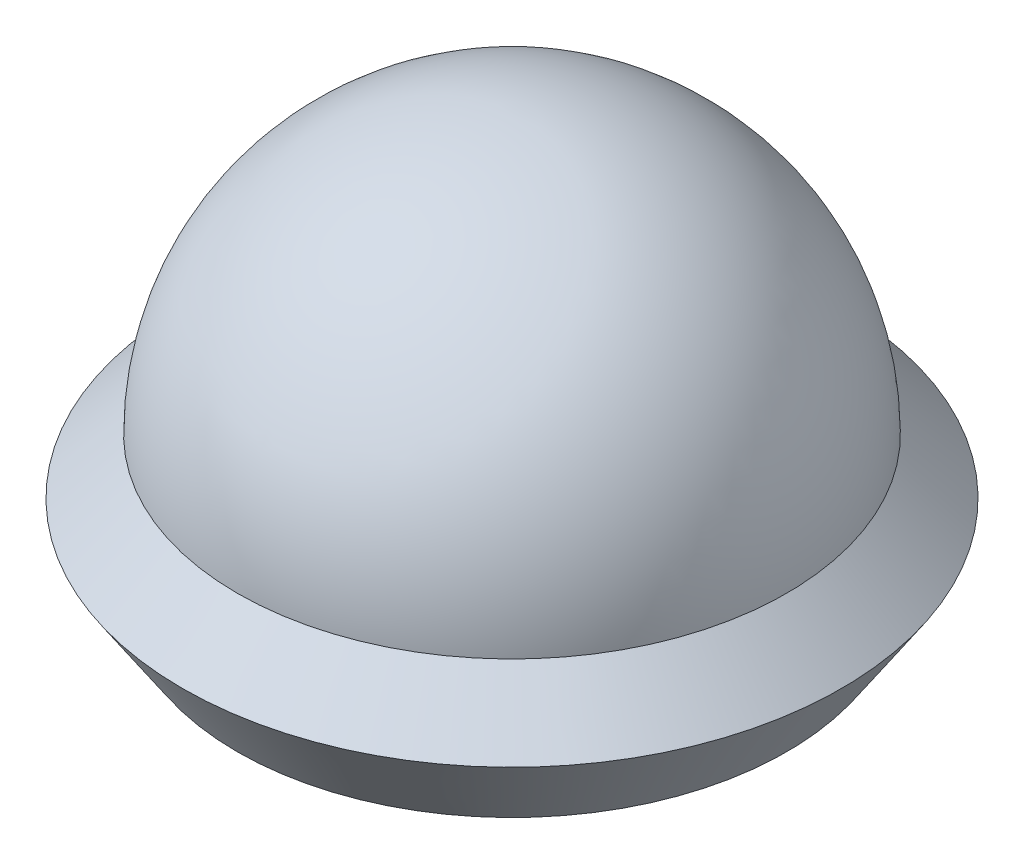
ISO-10303-21;
HEADER;
FILE_DESCRIPTION(('STEP AP214'),'2;1');
FILE_NAME('part.step','',(''),(''),'','','');
FILE_SCHEMA(('AUTOMOTIVE_DESIGN { 1 0 10303 214 1 1 1 1 }'));
ENDSEC;
DATA;
#1=APPLICATION_CONTEXT('core data for automotive mechanical design processes');
#2=APPLICATION_PROTOCOL_DEFINITION('international standard','automotive_design',2000,#1);
#3=PRODUCT_CONTEXT('',#1,'mechanical');
#4=PRODUCT('Part','Part','',(#3));
#5=PRODUCT_RELATED_PRODUCT_CATEGORY('part','',(#4));
#6=PRODUCT_DEFINITION_FORMATION('','',#4);
#7=PRODUCT_DEFINITION_CONTEXT('part definition',#1,'design');
#8=PRODUCT_DEFINITION('design','',#6,#7);
#9=PRODUCT_DEFINITION_SHAPE('','',#8);
#10=(LENGTH_UNIT() NAMED_UNIT(*) SI_UNIT(.MILLI.,.METRE.));
#11=(NAMED_UNIT(*) PLANE_ANGLE_UNIT() SI_UNIT($,.RADIAN.));
#12=(NAMED_UNIT(*) SI_UNIT($,.STERADIAN.) SOLID_ANGLE_UNIT());
#13=UNCERTAINTY_MEASURE_WITH_UNIT(LENGTH_MEASURE(1.E-05),#10,'distance_accuracy_value','');
#14=(GEOMETRIC_REPRESENTATION_CONTEXT(3) GLOBAL_UNCERTAINTY_ASSIGNED_CONTEXT((#13)) GLOBAL_UNIT_ASSIGNED_CONTEXT((#10,
#11,#12)) REPRESENTATION_CONTEXT('',''));
#15=CARTESIAN_POINT('',(0.,0.,0.));
#16=DIRECTION('',(0.,0.,1.));
#17=DIRECTION('',(1.,0.,0.));
#18=AXIS2_PLACEMENT_3D('',#15,#16,#17);
#19=CARTESIAN_POINT('',(0.,6.,0.));
#20=DIRECTION('',(0.,-1.,0.));
#21=DIRECTION('',(0.,0.,-1.));
#22=AXIS2_PLACEMENT_3D('',#19,#20,#21);
#23=CONICAL_SURFACE('',#22,24.,0.785398163397448);
#24=CARTESIAN_POINT('',(0.,10.,0.));
#25=DIRECTION('',(0.,-1.,0.));
#26=DIRECTION('',(0.,0.,1.));
#27=AXIS2_PLACEMENT_3D('',#24,#25,#26);
#28=CIRCLE('',#27,20.);
#29=CARTESIAN_POINT('',(0.,9.99999999999986,20.));
#30=VERTEX_POINT('',#29);
#31=EDGE_CURVE('E112',#30,#30,#28,.T.);
#32=ORIENTED_EDGE('',*,*,#31,.T.);
#33=EDGE_LOOP('',(#32));
#34=FACE_BOUND('',#33,.T.);
#35=CARTESIAN_POINT('',(0.,6.,0.));
#36=DIRECTION('',(0.,-1.,0.));
#37=DIRECTION('',(0.,0.,-1.));
#38=AXIS2_PLACEMENT_3D('',#35,#36,#37);
#39=CIRCLE('',#38,24.);
#40=CARTESIAN_POINT('',(0.,6.,-24.));
#41=VERTEX_POINT('',#40);
#42=EDGE_CURVE('E11',#41,#41,#39,.T.);
#43=ORIENTED_EDGE('',*,*,#42,.F.);
#44=EDGE_LOOP('',(#43));
#45=FACE_BOUND('',#44,.T.);
#46=ADVANCED_FACE('F37',(#34,#45),#23,.T.);
#47=CARTESIAN_POINT('',(0.,0.,0.));
#48=DIRECTION('',(0.,1.,0.));
#49=DIRECTION('',(0.,0.,1.));
#50=AXIS2_PLACEMENT_3D('',#47,#48,#49);
#51=CONICAL_SURFACE('',#50,20.,0.588002603547568);
#52=ORIENTED_EDGE('',*,*,#42,.T.);
#53=EDGE_LOOP('',(#52));
#54=FACE_BOUND('',#53,.T.);
#55=CARTESIAN_POINT('',(0.,0.,0.));
#56=DIRECTION('',(0.,-1.,0.));
#57=DIRECTION('',(0.,0.,-1.));
#58=AXIS2_PLACEMENT_3D('',#55,#56,#57);
#59=CIRCLE('',#58,20.);
#60=CARTESIAN_POINT('',(0.,0.,-20.));
#61=VERTEX_POINT('',#60);
#62=EDGE_CURVE('E44',#61,#61,#59,.T.);
#63=ORIENTED_EDGE('',*,*,#62,.F.);
#64=EDGE_LOOP('',(#63));
#65=FACE_BOUND('',#64,.T.);
#66=ADVANCED_FACE('F121',(#54,#65),#51,.T.);
#67=CARTESIAN_POINT('',(0.,0.,0.));
#68=DIRECTION('',(0.,-1.,0.));
#69=DIRECTION('',(0.,0.,-1.));
#70=AXIS2_PLACEMENT_3D('',#67,#68,#69);
#71=PLANE('',#70);
#72=DIRECTION('',(0.,0.,1.));
#73=VECTOR('',#72,1.);
#74=CARTESIAN_POINT('',(5.25,0.,-2.25));
#75=LINE('',#74,#73);
#76=CARTESIAN_POINT('',(5.25,0.,-2.25));
#77=VERTEX_POINT('',#76);
#78=CARTESIAN_POINT('',(5.25,0.,2.25));
#79=VERTEX_POINT('',#78);
#80=EDGE_CURVE('E51',#77,#79,#75,.T.);
#81=ORIENTED_EDGE('',*,*,#80,.F.);
#82=DIRECTION('',(1.,0.,0.));
#83=VECTOR('',#82,1.);
#84=CARTESIAN_POINT('',(-5.25,0.,-2.25));
#85=LINE('',#84,#83);
#86=CARTESIAN_POINT('',(-5.25,0.,-2.25));
#87=VERTEX_POINT('',#86);
#88=EDGE_CURVE('E102',#87,#77,#85,.T.);
#89=ORIENTED_EDGE('',*,*,#88,.F.);
#90=DIRECTION('',(0.,0.,-1.));
#91=VECTOR('',#90,1.);
#92=CARTESIAN_POINT('',(-5.25,0.,-2.25));
#93=LINE('',#92,#91);
#94=CARTESIAN_POINT('',(-5.25,0.,2.25));
#95=VERTEX_POINT('',#94);
#96=EDGE_CURVE('E108',#95,#87,#93,.T.);
#97=ORIENTED_EDGE('',*,*,#96,.F.);
#98=DIRECTION('',(-1.,0.,0.));
#99=VECTOR('',#98,1.);
#100=CARTESIAN_POINT('',(-5.25,0.,2.25));
#101=LINE('',#100,#99);
#102=EDGE_CURVE('E86',#79,#95,#101,.T.);
#103=ORIENTED_EDGE('',*,*,#102,.F.);
#104=EDGE_LOOP('',(#81,#89,#97,#103));
#105=FACE_BOUND('',#104,.T.);
#106=ORIENTED_EDGE('',*,*,#62,.T.);
#107=EDGE_LOOP('',(#106));
#108=FACE_BOUND('',#107,.T.);
#109=ADVANCED_FACE('F119',(#105,#108),#71,.T.);
#110=CARTESIAN_POINT('',(0.,10.,0.));
#111=DIRECTION('',(-1.,0.,0.));
#112=DIRECTION('',(0.,0.,1.));
#113=AXIS2_PLACEMENT_3D('',#110,#111,#112);
#114=SPHERICAL_SURFACE('',#113,20.);
#115=CARTESIAN_POINT('',(0.,10.,0.));
#116=DIRECTION('',(0.,-1.,0.));
#117=DIRECTION('',(0.,0.,1.));
#118=AXIS2_PLACEMENT_3D('',#115,#116,#117);
#119=SPHERICAL_SURFACE('',#118,20.);
#120=ORIENTED_EDGE('',*,*,#31,.F.);
#121=EDGE_LOOP('',(#120));
#122=FACE_BOUND('',#121,.T.);
#123=ADVANCED_FACE('F128',(#122),#119,.T.);
#124=CARTESIAN_POINT('',(5.25,15.,-2.25));
#125=DIRECTION('',(1.,0.,0.));
#126=DIRECTION('',(0.,0.,-1.));
#127=AXIS2_PLACEMENT_3D('',#124,#125,#126);
#128=PLANE('',#127);
#129=ORIENTED_EDGE('',*,*,#80,.T.);
#130=DIRECTION('',(0.,-1.,0.));
#131=VECTOR('',#130,1.);
#132=CARTESIAN_POINT('',(5.25,15.,2.25));
#133=LINE('',#132,#131);
#134=CARTESIAN_POINT('',(5.25,15.,2.25));
#135=VERTEX_POINT('',#134);
#136=EDGE_CURVE('E74',#135,#79,#133,.T.);
#137=ORIENTED_EDGE('',*,*,#136,.F.);
#138=DIRECTION('',(0.,0.,1.));
#139=VECTOR('',#138,1.);
#140=CARTESIAN_POINT('',(5.25,15.,-2.25));
#141=LINE('',#140,#139);
#142=CARTESIAN_POINT('',(5.25,15.,-2.25));
#143=VERTEX_POINT('',#142);
#144=EDGE_CURVE('E100',#143,#135,#141,.T.);
#145=ORIENTED_EDGE('',*,*,#144,.F.);
#146=DIRECTION('',(0.,-1.,0.));
#147=VECTOR('',#146,1.);
#148=CARTESIAN_POINT('',(5.25,15.,-2.25));
#149=LINE('',#148,#147);
#150=EDGE_CURVE('E59',#143,#77,#149,.T.);
#151=ORIENTED_EDGE('',*,*,#150,.T.);
#152=EDGE_LOOP('',(#129,#137,#145,#151));
#153=FACE_BOUND('',#152,.T.);
#154=ADVANCED_FACE('F135',(#153),#128,.F.);
#155=CARTESIAN_POINT('',(-5.25,15.,-2.25));
#156=DIRECTION('',(0.,0.,-1.));
#157=DIRECTION('',(-1.,0.,0.));
#158=AXIS2_PLACEMENT_3D('',#155,#156,#157);
#159=PLANE('',#158);
#160=ORIENTED_EDGE('',*,*,#88,.T.);
#161=ORIENTED_EDGE('',*,*,#150,.F.);
#162=DIRECTION('',(1.,0.,0.));
#163=VECTOR('',#162,1.);
#164=CARTESIAN_POINT('',(-5.25,15.,-2.25));
#165=LINE('',#164,#163);
#166=CARTESIAN_POINT('',(-5.25,15.,-2.25));
#167=VERTEX_POINT('',#166);
#168=EDGE_CURVE('E97',#167,#143,#165,.T.);
#169=ORIENTED_EDGE('',*,*,#168,.F.);
#170=DIRECTION('',(0.,-1.,0.));
#171=VECTOR('',#170,1.);
#172=CARTESIAN_POINT('',(-5.25,15.,-2.25));
#173=LINE('',#172,#171);
#174=EDGE_CURVE('E90',#167,#87,#173,.T.);
#175=ORIENTED_EDGE('',*,*,#174,.T.);
#176=EDGE_LOOP('',(#160,#161,#169,#175));
#177=FACE_BOUND('',#176,.T.);
#178=ADVANCED_FACE('F139',(#177),#159,.F.);
#179=CARTESIAN_POINT('',(-5.25,15.,-2.25));
#180=DIRECTION('',(-1.,0.,0.));
#181=DIRECTION('',(0.,0.,1.));
#182=AXIS2_PLACEMENT_3D('',#179,#180,#181);
#183=PLANE('',#182);
#184=ORIENTED_EDGE('',*,*,#96,.T.);
#185=ORIENTED_EDGE('',*,*,#174,.F.);
#186=DIRECTION('',(0.,0.,-1.));
#187=VECTOR('',#186,1.);
#188=CARTESIAN_POINT('',(-5.25,15.,-2.25));
#189=LINE('',#188,#187);
#190=CARTESIAN_POINT('',(-5.25,15.,2.25));
#191=VERTEX_POINT('',#190);
#192=EDGE_CURVE('E93',#191,#167,#189,.T.);
#193=ORIENTED_EDGE('',*,*,#192,.F.);
#194=DIRECTION('',(0.,-1.,0.));
#195=VECTOR('',#194,1.);
#196=CARTESIAN_POINT('',(-5.25,15.,2.25));
#197=LINE('',#196,#195);
#198=EDGE_CURVE('E79',#191,#95,#197,.T.);
#199=ORIENTED_EDGE('',*,*,#198,.T.);
#200=EDGE_LOOP('',(#184,#185,#193,#199));
#201=FACE_BOUND('',#200,.T.);
#202=ADVANCED_FACE('F94',(#201),#183,.F.);
#203=CARTESIAN_POINT('',(-5.25,15.,2.25));
#204=DIRECTION('',(0.,0.,1.));
#205=DIRECTION('',(1.,0.,0.));
#206=AXIS2_PLACEMENT_3D('',#203,#204,#205);
#207=PLANE('',#206);
#208=ORIENTED_EDGE('',*,*,#102,.T.);
#209=ORIENTED_EDGE('',*,*,#198,.F.);
#210=DIRECTION('',(-1.,0.,0.));
#211=VECTOR('',#210,1.);
#212=CARTESIAN_POINT('',(-5.25,15.,2.25));
#213=LINE('',#212,#211);
#214=EDGE_CURVE('E83',#135,#191,#213,.T.);
#215=ORIENTED_EDGE('',*,*,#214,.F.);
#216=ORIENTED_EDGE('',*,*,#136,.T.);
#217=EDGE_LOOP('',(#208,#209,#215,#216));
#218=FACE_BOUND('',#217,.T.);
#219=ADVANCED_FACE('F81',(#218),#207,.F.);
#220=CARTESIAN_POINT('',(0.,15.,0.));
#221=DIRECTION('',(0.,1.,0.));
#222=DIRECTION('',(0.,0.,1.));
#223=AXIS2_PLACEMENT_3D('',#220,#221,#222);
#224=PLANE('',#223);
#225=ORIENTED_EDGE('',*,*,#144,.T.);
#226=ORIENTED_EDGE('',*,*,#214,.T.);
#227=ORIENTED_EDGE('',*,*,#192,.T.);
#228=ORIENTED_EDGE('',*,*,#168,.T.);
#229=EDGE_LOOP('',(#225,#226,#227,#228));
#230=FACE_BOUND('',#229,.T.);
#231=ADVANCED_FACE('F99',(#230),#224,.F.);
#232=CLOSED_SHELL('',(#46,#66,#109,#123,#154,#178,#202,#219,#231));
#233=MANIFOLD_SOLID_BREP('B2',#232);
#234=ADVANCED_BREP_SHAPE_REPRESENTATION('',(#18,#233),#14);
#235=SHAPE_DEFINITION_REPRESENTATION(#9,#234);
ENDSEC;
END-ISO-10303-21;
